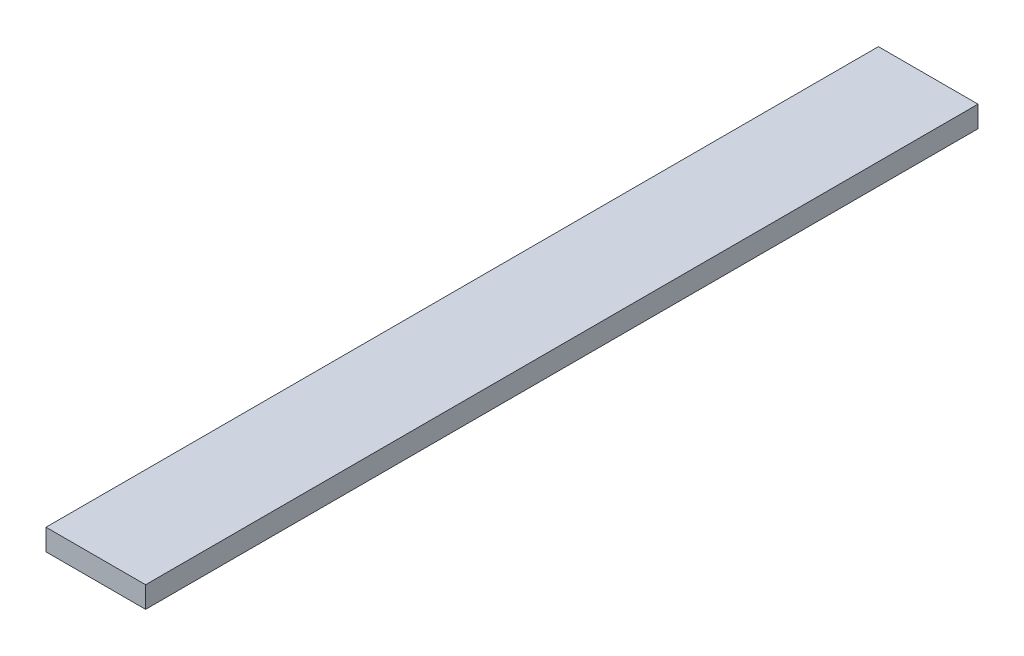
ISO-10303-21;
HEADER;
FILE_DESCRIPTION(('STEP AP214'),'2;1');
FILE_NAME('part.step','',(''),(''),'','','');
FILE_SCHEMA(('AUTOMOTIVE_DESIGN { 1 0 10303 214 1 1 1 1 }'));
ENDSEC;
DATA;
#1=APPLICATION_CONTEXT('core data for automotive mechanical design processes');
#2=APPLICATION_PROTOCOL_DEFINITION('international standard','automotive_design',2000,#1);
#3=PRODUCT_CONTEXT('',#1,'mechanical');
#4=PRODUCT('Part','Part','',(#3));
#5=PRODUCT_RELATED_PRODUCT_CATEGORY('part','',(#4));
#6=PRODUCT_DEFINITION_FORMATION('','',#4);
#7=PRODUCT_DEFINITION_CONTEXT('part definition',#1,'design');
#8=PRODUCT_DEFINITION('design','',#6,#7);
#9=PRODUCT_DEFINITION_SHAPE('','',#8);
#10=(LENGTH_UNIT() NAMED_UNIT(*) SI_UNIT(.MILLI.,.METRE.));
#11=(NAMED_UNIT(*) PLANE_ANGLE_UNIT() SI_UNIT($,.RADIAN.));
#12=(NAMED_UNIT(*) SI_UNIT($,.STERADIAN.) SOLID_ANGLE_UNIT());
#13=UNCERTAINTY_MEASURE_WITH_UNIT(LENGTH_MEASURE(1.E-05),#10,'distance_accuracy_value','');
#14=(GEOMETRIC_REPRESENTATION_CONTEXT(3) GLOBAL_UNCERTAINTY_ASSIGNED_CONTEXT((#13)) GLOBAL_UNIT_ASSIGNED_CONTEXT((#10,
#11,#12)) REPRESENTATION_CONTEXT('',''));
#15=CARTESIAN_POINT('',(0.,0.,0.));
#16=DIRECTION('',(0.,0.,1.));
#17=DIRECTION('',(1.,0.,0.));
#18=AXIS2_PLACEMENT_3D('',#15,#16,#17);
#19=CARTESIAN_POINT('',(-35.,7.5,585.));
#20=DIRECTION('',(1.,0.,0.));
#21=DIRECTION('',(0.,0.,-1.));
#22=AXIS2_PLACEMENT_3D('',#19,#20,#21);
#23=PLANE('',#22);
#24=DIRECTION('',(0.,-1.,0.));
#25=VECTOR('',#24,1.);
#26=CARTESIAN_POINT('',(-35.,7.5,0.));
#27=LINE('',#26,#25);
#28=CARTESIAN_POINT('',(-35.,7.5,0.));
#29=VERTEX_POINT('',#28);
#30=CARTESIAN_POINT('',(-35.,-7.5,0.));
#31=VERTEX_POINT('',#30);
#32=EDGE_CURVE('E106',#29,#31,#27,.T.);
#33=ORIENTED_EDGE('',*,*,#32,.T.);
#34=DIRECTION('',(0.,0.,-1.));
#35=VECTOR('',#34,1.);
#36=CARTESIAN_POINT('',(-35.,-7.5,585.));
#37=LINE('',#36,#35);
#38=CARTESIAN_POINT('',(-35.,-7.5,585.));
#39=VERTEX_POINT('',#38);
#40=EDGE_CURVE('E11',#39,#31,#37,.T.);
#41=ORIENTED_EDGE('',*,*,#40,.F.);
#42=DIRECTION('',(0.,-1.,0.));
#43=VECTOR('',#42,1.);
#44=CARTESIAN_POINT('',(-35.,7.5,585.));
#45=LINE('',#44,#43);
#46=CARTESIAN_POINT('',(-35.,7.5,585.));
#47=VERTEX_POINT('',#46);
#48=EDGE_CURVE('E94',#47,#39,#45,.T.);
#49=ORIENTED_EDGE('',*,*,#48,.F.);
#50=DIRECTION('',(0.,0.,-1.));
#51=VECTOR('',#50,1.);
#52=CARTESIAN_POINT('',(-35.,7.5,585.));
#53=LINE('',#52,#51);
#54=EDGE_CURVE('E102',#47,#29,#53,.T.);
#55=ORIENTED_EDGE('',*,*,#54,.T.);
#56=EDGE_LOOP('',(#33,#41,#49,#55));
#57=FACE_BOUND('',#56,.T.);
#58=ADVANCED_FACE('F43',(#57),#23,.F.);
#59=CARTESIAN_POINT('',(35.,-7.49999999999999,585.));
#60=DIRECTION('',(0.,1.,0.));
#61=DIRECTION('',(-1.,0.,0.));
#62=AXIS2_PLACEMENT_3D('',#59,#60,#61);
#63=PLANE('',#62);
#64=DIRECTION('',(1.,0.,0.));
#65=VECTOR('',#64,1.);
#66=CARTESIAN_POINT('',(35.,-7.49999999999999,0.));
#67=LINE('',#66,#65);
#68=CARTESIAN_POINT('',(35.,-7.49999999999999,0.));
#69=VERTEX_POINT('',#68);
#70=EDGE_CURVE('E98',#31,#69,#67,.T.);
#71=ORIENTED_EDGE('',*,*,#70,.T.);
#72=DIRECTION('',(0.,0.,-1.));
#73=VECTOR('',#72,1.);
#74=CARTESIAN_POINT('',(35.,-7.49999999999999,585.));
#75=LINE('',#74,#73);
#76=CARTESIAN_POINT('',(35.,-7.49999999999999,585.));
#77=VERTEX_POINT('',#76);
#78=EDGE_CURVE('E51',#77,#69,#75,.T.);
#79=ORIENTED_EDGE('',*,*,#78,.F.);
#80=DIRECTION('',(1.,0.,0.));
#81=VECTOR('',#80,1.);
#82=CARTESIAN_POINT('',(35.,-7.49999999999999,585.));
#83=LINE('',#82,#81);
#84=EDGE_CURVE('E89',#39,#77,#83,.T.);
#85=ORIENTED_EDGE('',*,*,#84,.F.);
#86=ORIENTED_EDGE('',*,*,#40,.T.);
#87=EDGE_LOOP('',(#71,#79,#85,#86));
#88=FACE_BOUND('',#87,.T.);
#89=ADVANCED_FACE('F97',(#88),#63,.F.);
#90=CARTESIAN_POINT('',(35.,7.50000000000001,585.));
#91=DIRECTION('',(-1.,0.,0.));
#92=DIRECTION('',(0.,0.,1.));
#93=AXIS2_PLACEMENT_3D('',#90,#91,#92);
#94=PLANE('',#93);
#95=DIRECTION('',(0.,1.,0.));
#96=VECTOR('',#95,1.);
#97=CARTESIAN_POINT('',(35.,7.50000000000001,0.));
#98=LINE('',#97,#96);
#99=CARTESIAN_POINT('',(35.,7.50000000000001,0.));
#100=VERTEX_POINT('',#99);
#101=EDGE_CURVE('E76',#69,#100,#98,.T.);
#102=ORIENTED_EDGE('',*,*,#101,.T.);
#103=DIRECTION('',(0.,0.,-1.));
#104=VECTOR('',#103,1.);
#105=CARTESIAN_POINT('',(35.,7.50000000000001,585.));
#106=LINE('',#105,#104);
#107=CARTESIAN_POINT('',(35.,7.50000000000001,585.));
#108=VERTEX_POINT('',#107);
#109=EDGE_CURVE('E99',#108,#100,#106,.T.);
#110=ORIENTED_EDGE('',*,*,#109,.F.);
#111=DIRECTION('',(0.,1.,0.));
#112=VECTOR('',#111,1.);
#113=CARTESIAN_POINT('',(35.,7.50000000000001,585.));
#114=LINE('',#113,#112);
#115=EDGE_CURVE('E92',#77,#108,#114,.T.);
#116=ORIENTED_EDGE('',*,*,#115,.F.);
#117=ORIENTED_EDGE('',*,*,#78,.T.);
#118=EDGE_LOOP('',(#102,#110,#116,#117));
#119=FACE_BOUND('',#118,.T.);
#120=ADVANCED_FACE('F100',(#119),#94,.F.);
#121=CARTESIAN_POINT('',(35.,7.50000000000001,585.));
#122=DIRECTION('',(0.,-1.,0.));
#123=DIRECTION('',(1.,0.,0.));
#124=AXIS2_PLACEMENT_3D('',#121,#122,#123);
#125=PLANE('',#124);
#126=DIRECTION('',(-1.,0.,0.));
#127=VECTOR('',#126,1.);
#128=CARTESIAN_POINT('',(35.,7.50000000000001,0.));
#129=LINE('',#128,#127);
#130=EDGE_CURVE('E82',#100,#29,#129,.T.);
#131=ORIENTED_EDGE('',*,*,#130,.T.);
#132=ORIENTED_EDGE('',*,*,#54,.F.);
#133=DIRECTION('',(-1.,0.,0.));
#134=VECTOR('',#133,1.);
#135=CARTESIAN_POINT('',(35.,7.50000000000001,585.));
#136=LINE('',#135,#134);
#137=EDGE_CURVE('E59',#108,#47,#136,.T.);
#138=ORIENTED_EDGE('',*,*,#137,.F.);
#139=ORIENTED_EDGE('',*,*,#109,.T.);
#140=EDGE_LOOP('',(#131,#132,#138,#139));
#141=FACE_BOUND('',#140,.T.);
#142=ADVANCED_FACE('F113',(#141),#125,.F.);
#143=CARTESIAN_POINT('',(0.,0.,585.));
#144=DIRECTION('',(0.,0.,-1.));
#145=DIRECTION('',(-1.,0.,0.));
#146=AXIS2_PLACEMENT_3D('',#143,#144,#145);
#147=PLANE('',#146);
#148=ORIENTED_EDGE('',*,*,#48,.T.);
#149=ORIENTED_EDGE('',*,*,#84,.T.);
#150=ORIENTED_EDGE('',*,*,#115,.T.);
#151=ORIENTED_EDGE('',*,*,#137,.T.);
#152=EDGE_LOOP('',(#148,#149,#150,#151));
#153=FACE_BOUND('',#152,.T.);
#154=ADVANCED_FACE('F90',(#153),#147,.F.);
#155=CARTESIAN_POINT('',(0.,0.,0.));
#156=DIRECTION('',(0.,0.,-1.));
#157=DIRECTION('',(-1.,0.,0.));
#158=AXIS2_PLACEMENT_3D('',#155,#156,#157);
#159=PLANE('',#158);
#160=ORIENTED_EDGE('',*,*,#32,.F.);
#161=ORIENTED_EDGE('',*,*,#130,.F.);
#162=ORIENTED_EDGE('',*,*,#101,.F.);
#163=ORIENTED_EDGE('',*,*,#70,.F.);
#164=EDGE_LOOP('',(#160,#161,#162,#163));
#165=FACE_BOUND('',#164,.T.);
#166=ADVANCED_FACE('F116',(#165),#159,.T.);
#167=CLOSED_SHELL('',(#58,#89,#120,#142,#154,#166));
#168=MANIFOLD_SOLID_BREP('B2',#167);
#169=ADVANCED_BREP_SHAPE_REPRESENTATION('',(#18,#168),#14);
#170=SHAPE_DEFINITION_REPRESENTATION(#9,#169);
ENDSEC;
END-ISO-10303-21;
